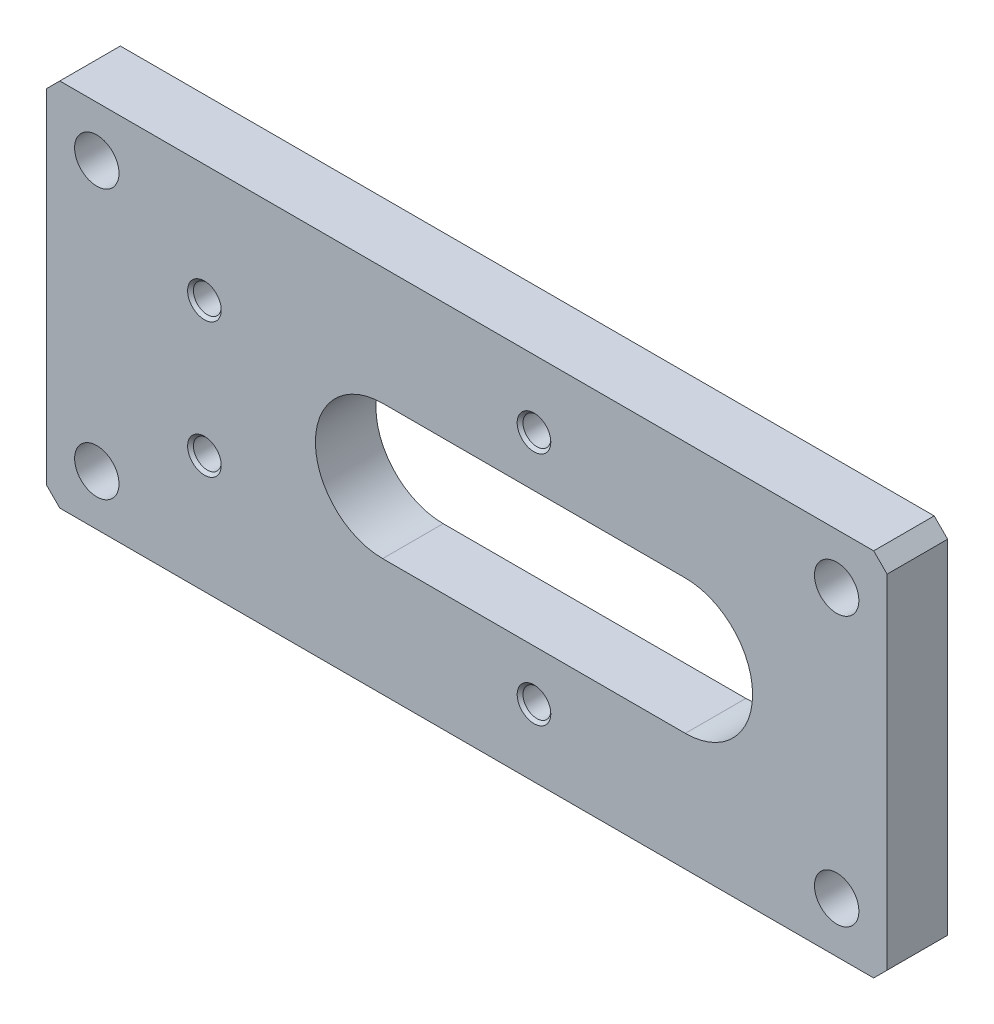
ISO-10303-21;
HEADER;
FILE_DESCRIPTION(('STEP AP214'),'2;1');
FILE_NAME('part.step','',(''),(''),'','','');
FILE_SCHEMA(('AUTOMOTIVE_DESIGN { 1 0 10303 214 1 1 1 1 }'));
ENDSEC;
DATA;
#1=APPLICATION_CONTEXT('core data for automotive mechanical design processes');
#2=APPLICATION_PROTOCOL_DEFINITION('international standard','automotive_design',2000,#1);
#3=PRODUCT_CONTEXT('',#1,'mechanical');
#4=PRODUCT('Part','Part','',(#3));
#5=PRODUCT_RELATED_PRODUCT_CATEGORY('part','',(#4));
#6=PRODUCT_DEFINITION_FORMATION('','',#4);
#7=PRODUCT_DEFINITION_CONTEXT('part definition',#1,'design');
#8=PRODUCT_DEFINITION('design','',#6,#7);
#9=PRODUCT_DEFINITION_SHAPE('','',#8);
#10=(LENGTH_UNIT() NAMED_UNIT(*) SI_UNIT(.MILLI.,.METRE.));
#11=(NAMED_UNIT(*) PLANE_ANGLE_UNIT() SI_UNIT($,.RADIAN.));
#12=(NAMED_UNIT(*) SI_UNIT($,.STERADIAN.) SOLID_ANGLE_UNIT());
#13=UNCERTAINTY_MEASURE_WITH_UNIT(LENGTH_MEASURE(1.E-05),#10,'distance_accuracy_value','');
#14=(GEOMETRIC_REPRESENTATION_CONTEXT(3) GLOBAL_UNCERTAINTY_ASSIGNED_CONTEXT((#13)) GLOBAL_UNIT_ASSIGNED_CONTEXT((#10,
#11,#12)) REPRESENTATION_CONTEXT('',''));
#15=CARTESIAN_POINT('',(0.,0.,0.));
#16=DIRECTION('',(0.,0.,1.));
#17=DIRECTION('',(1.,0.,0.));
#18=AXIS2_PLACEMENT_3D('',#15,#16,#17);
#19=CARTESIAN_POINT('',(12.5,17.5,9.0000000000714));
#20=DIRECTION('',(0.,0.,1.));
#21=DIRECTION('',(1.,0.,0.));
#22=AXIS2_PLACEMENT_3D('',#19,#20,#21);
#23=CONICAL_SURFACE('',#22,2.5000000000432,0.785398163397448);
#24=CARTESIAN_POINT('',(12.5,17.5,8.567));
#25=DIRECTION('',(0.,0.,1.));
#26=DIRECTION('',(1.,0.,0.));
#27=AXIS2_PLACEMENT_3D('',#24,#25,#26);
#28=CIRCLE('',#27,2.067);
#29=CARTESIAN_POINT('',(14.567,17.5,8.567));
#30=VERTEX_POINT('',#29);
#31=EDGE_CURVE('E121',#30,#30,#28,.F.);
#32=ORIENTED_EDGE('',*,*,#31,.T.);
#33=EDGE_LOOP('',(#32));
#34=FACE_BOUND('',#33,.T.);
#35=CARTESIAN_POINT('',(12.5,17.5,8.99999999995771));
#36=DIRECTION('',(0.,0.,1.));
#37=DIRECTION('',(1.,0.,0.));
#38=AXIS2_PLACEMENT_3D('',#35,#36,#37);
#39=CIRCLE('',#38,2.49999999992951);
#40=CARTESIAN_POINT('',(14.9999999999295,17.5,8.99999999995771));
#41=VERTEX_POINT('',#40);
#42=EDGE_CURVE('E20',#41,#41,#39,.F.);
#43=ORIENTED_EDGE('',*,*,#42,.F.);
#44=EDGE_LOOP('',(#43));
#45=FACE_BOUND('',#44,.T.);
#46=ADVANCED_FACE('F17',(#34,#45),#23,.F.);
#47=CARTESIAN_POINT('',(-36.5,10.,8.99999999990087));
#48=DIRECTION('',(0.,0.,1.));
#49=DIRECTION('',(1.,0.,0.));
#50=AXIS2_PLACEMENT_3D('',#47,#48,#49);
#51=CONICAL_SURFACE('',#50,2.4999999998945,0.785398163397448);
#52=CARTESIAN_POINT('',(-36.5,10.,8.567));
#53=DIRECTION('',(0.,0.,1.));
#54=DIRECTION('',(1.,0.,0.));
#55=AXIS2_PLACEMENT_3D('',#52,#53,#54);
#56=CIRCLE('',#55,2.067);
#57=CARTESIAN_POINT('',(-34.433,10.,8.567));
#58=VERTEX_POINT('',#57);
#59=EDGE_CURVE('E117',#58,#58,#56,.F.);
#60=ORIENTED_EDGE('',*,*,#59,.T.);
#61=EDGE_LOOP('',(#60));
#62=FACE_BOUND('',#61,.T.);
#63=CARTESIAN_POINT('',(-36.5,10.,9.00000000001455));
#64=DIRECTION('',(0.,0.,1.));
#65=DIRECTION('',(1.,0.,0.));
#66=AXIS2_PLACEMENT_3D('',#63,#64,#65);
#67=CIRCLE('',#66,2.50000000000818);
#68=CARTESIAN_POINT('',(-33.9999999999918,10.,9.00000000001455));
#69=VERTEX_POINT('',#68);
#70=EDGE_CURVE('E182',#69,#69,#67,.F.);
#71=ORIENTED_EDGE('',*,*,#70,.F.);
#72=EDGE_LOOP('',(#71));
#73=FACE_BOUND('',#72,.T.);
#74=ADVANCED_FACE('F196',(#62,#73),#51,.F.);
#75=CARTESIAN_POINT('',(-36.5,-10.,8.99999999990087));
#76=DIRECTION('',(0.,0.,1.));
#77=DIRECTION('',(1.,0.,0.));
#78=AXIS2_PLACEMENT_3D('',#75,#76,#77);
#79=CONICAL_SURFACE('',#78,2.4999999998945,0.785398163397448);
#80=CARTESIAN_POINT('',(-36.5,-10.,9.00000000001455));
#81=DIRECTION('',(0.,0.,1.));
#82=DIRECTION('',(1.,0.,0.));
#83=AXIS2_PLACEMENT_3D('',#80,#81,#82);
#84=CIRCLE('',#83,2.50000000000818);
#85=CARTESIAN_POINT('',(-33.9999999999918,-10.,9.00000000001455));
#86=VERTEX_POINT('',#85);
#87=EDGE_CURVE('E179',#86,#86,#84,.F.);
#88=ORIENTED_EDGE('',*,*,#87,.F.);
#89=EDGE_LOOP('',(#88));
#90=FACE_BOUND('',#89,.T.);
#91=CARTESIAN_POINT('',(-36.5,-10.,8.567));
#92=DIRECTION('',(0.,0.,1.));
#93=DIRECTION('',(1.,0.,0.));
#94=AXIS2_PLACEMENT_3D('',#91,#92,#93);
#95=CIRCLE('',#94,2.067);
#96=CARTESIAN_POINT('',(-34.433,-10.,8.567));
#97=VERTEX_POINT('',#96);
#98=EDGE_CURVE('E112',#97,#97,#95,.F.);
#99=ORIENTED_EDGE('',*,*,#98,.T.);
#100=EDGE_LOOP('',(#99));
#101=FACE_BOUND('',#100,.T.);
#102=ADVANCED_FACE('F201',(#90,#101),#79,.F.);
#103=CARTESIAN_POINT('',(12.5,-17.5,8.99999999990087));
#104=DIRECTION('',(0.,0.,1.));
#105=DIRECTION('',(1.,0.,0.));
#106=AXIS2_PLACEMENT_3D('',#103,#104,#105);
#107=CONICAL_SURFACE('',#106,2.49999999992951,0.785398163397448);
#108=CARTESIAN_POINT('',(12.5,-17.5,8.99999999995771));
#109=DIRECTION('',(0.,0.,1.));
#110=DIRECTION('',(1.,0.,0.));
#111=AXIS2_PLACEMENT_3D('',#108,#109,#110);
#112=CIRCLE('',#111,2.49999999998636);
#113=CARTESIAN_POINT('',(14.9999999999864,-17.5,8.99999999995771));
#114=VERTEX_POINT('',#113);
#115=EDGE_CURVE('E116',#114,#114,#112,.F.);
#116=ORIENTED_EDGE('',*,*,#115,.F.);
#117=EDGE_LOOP('',(#116));
#118=FACE_BOUND('',#117,.T.);
#119=CARTESIAN_POINT('',(12.5,-17.5,8.567));
#120=DIRECTION('',(0.,0.,1.));
#121=DIRECTION('',(1.,0.,0.));
#122=AXIS2_PLACEMENT_3D('',#119,#120,#121);
#123=CIRCLE('',#122,2.067);
#124=CARTESIAN_POINT('',(14.567,-17.5,8.567));
#125=VERTEX_POINT('',#124);
#126=EDGE_CURVE('E107',#125,#125,#123,.F.);
#127=ORIENTED_EDGE('',*,*,#126,.T.);
#128=EDGE_LOOP('',(#127));
#129=FACE_BOUND('',#128,.T.);
#130=ADVANCED_FACE('F305',(#118,#129),#107,.F.);
#131=CARTESIAN_POINT('',(12.5,17.5,0.));
#132=DIRECTION('',(0.,0.,1.));
#133=DIRECTION('',(1.,0.,0.));
#134=AXIS2_PLACEMENT_3D('',#131,#132,#133);
#135=CYLINDRICAL_SURFACE('',#134,2.067);
#136=ORIENTED_EDGE('',*,*,#31,.F.);
#137=EDGE_LOOP('',(#136));
#138=FACE_BOUND('',#137,.T.);
#139=CARTESIAN_POINT('',(12.5,17.5,0.432999999986805));
#140=DIRECTION('',(0.,0.,-1.));
#141=DIRECTION('',(-1.,0.,0.));
#142=AXIS2_PLACEMENT_3D('',#139,#140,#141);
#143=CIRCLE('',#142,2.06700000002229);
#144=CARTESIAN_POINT('',(10.4329999999777,17.5,0.432999999986805));
#145=VERTEX_POINT('',#144);
#146=EDGE_CURVE('E102',#145,#145,#143,.T.);
#147=ORIENTED_EDGE('',*,*,#146,.T.);
#148=EDGE_LOOP('',(#147));
#149=FACE_BOUND('',#148,.T.);
#150=ADVANCED_FACE('F301',(#138,#149),#135,.F.);
#151=CARTESIAN_POINT('',(-36.5,10.,0.));
#152=DIRECTION('',(0.,0.,1.));
#153=DIRECTION('',(1.,0.,0.));
#154=AXIS2_PLACEMENT_3D('',#151,#152,#153);
#155=CYLINDRICAL_SURFACE('',#154,2.067);
#156=CARTESIAN_POINT('',(-36.5,10.,0.433000000043648));
#157=DIRECTION('',(0.,0.,-1.));
#158=DIRECTION('',(-1.,0.,0.));
#159=AXIS2_PLACEMENT_3D('',#156,#157,#158);
#160=CIRCLE('',#159,2.06700000000046);
#161=CARTESIAN_POINT('',(-38.5670000000005,10.,0.433000000043648));
#162=VERTEX_POINT('',#161);
#163=EDGE_CURVE('E97',#162,#162,#160,.T.);
#164=ORIENTED_EDGE('',*,*,#163,.T.);
#165=EDGE_LOOP('',(#164));
#166=FACE_BOUND('',#165,.T.);
#167=ORIENTED_EDGE('',*,*,#59,.F.);
#168=EDGE_LOOP('',(#167));
#169=FACE_BOUND('',#168,.T.);
#170=ADVANCED_FACE('F297',(#166,#169),#155,.F.);
#171=CARTESIAN_POINT('',(0.,0.,9.));
#172=DIRECTION('',(0.,0.,1.));
#173=DIRECTION('',(1.,0.,0.));
#174=AXIS2_PLACEMENT_3D('',#171,#172,#173);
#175=PLANE('',#174);
#176=ORIENTED_EDGE('',*,*,#115,.T.);
#177=EDGE_LOOP('',(#176));
#178=FACE_BOUND('',#177,.T.);
#179=ORIENTED_EDGE('',*,*,#87,.T.);
#180=EDGE_LOOP('',(#179));
#181=FACE_BOUND('',#180,.T.);
#182=CARTESIAN_POINT('',(57.5,-20.,9.));
#183=DIRECTION('',(0.,0.,1.));
#184=DIRECTION('',(1.,0.,0.));
#185=AXIS2_PLACEMENT_3D('',#182,#183,#184);
#186=CIRCLE('',#185,3.3);
#187=CARTESIAN_POINT('',(60.8,-20.,9.));
#188=VERTEX_POINT('',#187);
#189=EDGE_CURVE('E161',#188,#188,#186,.F.);
#190=ORIENTED_EDGE('',*,*,#189,.T.);
#191=EDGE_LOOP('',(#190));
#192=FACE_BOUND('',#191,.T.);
#193=CARTESIAN_POINT('',(57.5,20.,9.));
#194=DIRECTION('',(0.,0.,1.));
#195=DIRECTION('',(1.,0.,0.));
#196=AXIS2_PLACEMENT_3D('',#193,#194,#195);
#197=CIRCLE('',#196,3.3);
#198=CARTESIAN_POINT('',(60.8,20.,9.));
#199=VERTEX_POINT('',#198);
#200=EDGE_CURVE('E88',#199,#199,#197,.F.);
#201=ORIENTED_EDGE('',*,*,#200,.T.);
#202=EDGE_LOOP('',(#201));
#203=FACE_BOUND('',#202,.T.);
#204=DIRECTION('',(1.,0.,0.));
#205=VECTOR('',#204,1.);
#206=CARTESIAN_POINT('',(-10.,-10.,9.));
#207=LINE('',#206,#205);
#208=CARTESIAN_POINT('',(-10.,-10.,9.));
#209=VERTEX_POINT('',#208);
#210=CARTESIAN_POINT('',(35.,-10.,9.));
#211=VERTEX_POINT('',#210);
#212=EDGE_CURVE('E69',#209,#211,#207,.T.);
#213=ORIENTED_EDGE('',*,*,#212,.F.);
#214=CARTESIAN_POINT('',(-10.,0.,9.));
#215=DIRECTION('',(0.,0.,1.));
#216=DIRECTION('',(1.,0.,0.));
#217=AXIS2_PLACEMENT_3D('',#214,#215,#216);
#218=CIRCLE('',#217,10.);
#219=CARTESIAN_POINT('',(-10.,10.,9.));
#220=VERTEX_POINT('',#219);
#221=EDGE_CURVE('E77',#209,#220,#218,.F.);
#222=ORIENTED_EDGE('',*,*,#221,.T.);
#223=DIRECTION('',(1.,0.,0.));
#224=VECTOR('',#223,1.);
#225=CARTESIAN_POINT('',(35.,10.,9.));
#226=LINE('',#225,#224);
#227=CARTESIAN_POINT('',(35.,10.,9.));
#228=VERTEX_POINT('',#227);
#229=EDGE_CURVE('E73',#228,#220,#226,.F.);
#230=ORIENTED_EDGE('',*,*,#229,.F.);
#231=CARTESIAN_POINT('',(35.,0.,9.));
#232=DIRECTION('',(0.,0.,1.));
#233=DIRECTION('',(1.,0.,0.));
#234=AXIS2_PLACEMENT_3D('',#231,#232,#233);
#235=CIRCLE('',#234,10.);
#236=EDGE_CURVE('E60',#228,#211,#235,.F.);
#237=ORIENTED_EDGE('',*,*,#236,.T.);
#238=EDGE_LOOP('',(#213,#222,#230,#237));
#239=FACE_BOUND('',#238,.T.);
#240=CARTESIAN_POINT('',(-52.5,-20.,9.));
#241=DIRECTION('',(0.,0.,1.));
#242=DIRECTION('',(1.,0.,0.));
#243=AXIS2_PLACEMENT_3D('',#240,#241,#242);
#244=CIRCLE('',#243,3.3);
#245=CARTESIAN_POINT('',(-49.2,-20.,9.));
#246=VERTEX_POINT('',#245);
#247=EDGE_CURVE('E70',#246,#246,#244,.F.);
#248=ORIENTED_EDGE('',*,*,#247,.T.);
#249=EDGE_LOOP('',(#248));
#250=FACE_BOUND('',#249,.T.);
#251=CARTESIAN_POINT('',(-52.5,20.,9.));
#252=DIRECTION('',(0.,0.,1.));
#253=DIRECTION('',(1.,0.,0.));
#254=AXIS2_PLACEMENT_3D('',#251,#252,#253);
#255=CIRCLE('',#254,3.3);
#256=CARTESIAN_POINT('',(-49.2,20.,9.));
#257=VERTEX_POINT('',#256);
#258=EDGE_CURVE('E101',#257,#257,#255,.F.);
#259=ORIENTED_EDGE('',*,*,#258,.T.);
#260=EDGE_LOOP('',(#259));
#261=FACE_BOUND('',#260,.T.);
#262=ORIENTED_EDGE('',*,*,#70,.T.);
#263=EDGE_LOOP('',(#262));
#264=FACE_BOUND('',#263,.T.);
#265=ORIENTED_EDGE('',*,*,#42,.T.);
#266=EDGE_LOOP('',(#265));
#267=FACE_BOUND('',#266,.T.);
#268=DIRECTION('',(0.707106781186548,-0.707106781186547,0.));
#269=VECTOR('',#268,1.);
#270=CARTESIAN_POINT('',(65.,25.5,9.));
#271=LINE('',#270,#269);
#272=CARTESIAN_POINT('',(65.,25.5,9.));
#273=VERTEX_POINT('',#272);
#274=CARTESIAN_POINT('',(63.,27.5,9.));
#275=VERTEX_POINT('',#274);
#276=EDGE_CURVE('E406',#273,#275,#271,.F.);
#277=ORIENTED_EDGE('',*,*,#276,.T.);
#278=DIRECTION('',(1.,0.,0.));
#279=VECTOR('',#278,1.);
#280=CARTESIAN_POINT('',(63.,27.5,9.));
#281=LINE('',#280,#279);
#282=CARTESIAN_POINT('',(-58.,27.5,9.));
#283=VERTEX_POINT('',#282);
#284=EDGE_CURVE('E400',#275,#283,#281,.F.);
#285=ORIENTED_EDGE('',*,*,#284,.T.);
#286=DIRECTION('',(0.707106781186547,0.707106781186548,0.));
#287=VECTOR('',#286,1.);
#288=CARTESIAN_POINT('',(-58.,27.5,9.));
#289=LINE('',#288,#287);
#290=CARTESIAN_POINT('',(-60.,25.5,9.));
#291=VERTEX_POINT('',#290);
#292=EDGE_CURVE('E394',#283,#291,#289,.F.);
#293=ORIENTED_EDGE('',*,*,#292,.T.);
#294=DIRECTION('',(0.,1.,0.));
#295=VECTOR('',#294,1.);
#296=CARTESIAN_POINT('',(-60.,25.5,9.));
#297=LINE('',#296,#295);
#298=CARTESIAN_POINT('',(-60.,-25.5,9.));
#299=VERTEX_POINT('',#298);
#300=EDGE_CURVE('E111',#291,#299,#297,.F.);
#301=ORIENTED_EDGE('',*,*,#300,.T.);
#302=DIRECTION('',(-0.707106781186547,0.707106781186548,0.));
#303=VECTOR('',#302,1.);
#304=CARTESIAN_POINT('',(-60.,-25.5,9.));
#305=LINE('',#304,#303);
#306=CARTESIAN_POINT('',(-58.,-27.5,9.));
#307=VERTEX_POINT('',#306);
#308=EDGE_CURVE('E435',#299,#307,#305,.F.);
#309=ORIENTED_EDGE('',*,*,#308,.T.);
#310=DIRECTION('',(1.,0.,0.));
#311=VECTOR('',#310,1.);
#312=CARTESIAN_POINT('',(-58.,-27.5,9.));
#313=LINE('',#312,#311);
#314=CARTESIAN_POINT('',(63.,-27.5,9.));
#315=VERTEX_POINT('',#314);
#316=EDGE_CURVE('E427',#307,#315,#313,.T.);
#317=ORIENTED_EDGE('',*,*,#316,.T.);
#318=DIRECTION('',(-0.707106781186548,-0.707106781186547,0.));
#319=VECTOR('',#318,1.);
#320=CARTESIAN_POINT('',(63.,-27.5,9.));
#321=LINE('',#320,#319);
#322=CARTESIAN_POINT('',(65.,-25.5,9.));
#323=VERTEX_POINT('',#322);
#324=EDGE_CURVE('E419',#315,#323,#321,.F.);
#325=ORIENTED_EDGE('',*,*,#324,.T.);
#326=DIRECTION('',(0.,1.,0.));
#327=VECTOR('',#326,1.);
#328=CARTESIAN_POINT('',(65.,-25.5,9.));
#329=LINE('',#328,#327);
#330=EDGE_CURVE('E411',#323,#273,#329,.T.);
#331=ORIENTED_EDGE('',*,*,#330,.T.);
#332=EDGE_LOOP('',(#277,#285,#293,#301,#309,#317,#325,#331));
#333=FACE_BOUND('',#332,.T.);
#334=ADVANCED_FACE('F79',(#178,#181,#192,#203,#239,#250,#261,#264,#267,#333),#175,.T.);
#335=CARTESIAN_POINT('',(-36.5,-10.,0.));
#336=DIRECTION('',(0.,0.,1.));
#337=DIRECTION('',(1.,0.,0.));
#338=AXIS2_PLACEMENT_3D('',#335,#336,#337);
#339=CYLINDRICAL_SURFACE('',#338,2.067);
#340=CARTESIAN_POINT('',(-36.5,-10.,0.433000000043648));
#341=DIRECTION('',(0.,0.,-1.));
#342=DIRECTION('',(-1.,0.,0.));
#343=AXIS2_PLACEMENT_3D('',#340,#341,#342);
#344=CIRCLE('',#343,2.06700000000046);
#345=CARTESIAN_POINT('',(-38.5670000000005,-10.,0.433000000043648));
#346=VERTEX_POINT('',#345);
#347=EDGE_CURVE('E92',#346,#346,#344,.T.);
#348=ORIENTED_EDGE('',*,*,#347,.T.);
#349=EDGE_LOOP('',(#348));
#350=FACE_BOUND('',#349,.T.);
#351=ORIENTED_EDGE('',*,*,#98,.F.);
#352=EDGE_LOOP('',(#351));
#353=FACE_BOUND('',#352,.T.);
#354=ADVANCED_FACE('F290',(#350,#353),#339,.F.);
#355=CARTESIAN_POINT('',(12.5,-17.5,0.));
#356=DIRECTION('',(0.,0.,1.));
#357=DIRECTION('',(1.,0.,0.));
#358=AXIS2_PLACEMENT_3D('',#355,#356,#357);
#359=CYLINDRICAL_SURFACE('',#358,2.067);
#360=CARTESIAN_POINT('',(12.5,-17.5,0.432999999986805));
#361=DIRECTION('',(0.,0.,-1.));
#362=DIRECTION('',(-1.,0.,0.));
#363=AXIS2_PLACEMENT_3D('',#360,#361,#362);
#364=CIRCLE('',#363,2.06700000002229);
#365=CARTESIAN_POINT('',(10.4329999999777,-17.5,0.432999999986805));
#366=VERTEX_POINT('',#365);
#367=EDGE_CURVE('E385',#366,#366,#364,.T.);
#368=ORIENTED_EDGE('',*,*,#367,.T.);
#369=EDGE_LOOP('',(#368));
#370=FACE_BOUND('',#369,.T.);
#371=ORIENTED_EDGE('',*,*,#126,.F.);
#372=EDGE_LOOP('',(#371));
#373=FACE_BOUND('',#372,.T.);
#374=ADVANCED_FACE('F286',(#370,#373),#359,.F.);
#375=CARTESIAN_POINT('',(-60.,25.5,9.));
#376=DIRECTION('',(1.,0.,0.));
#377=DIRECTION('',(0.,0.,-1.));
#378=AXIS2_PLACEMENT_3D('',#375,#376,#377);
#379=PLANE('',#378);
#380=DIRECTION('',(0.,0.,1.));
#381=VECTOR('',#380,1.);
#382=CARTESIAN_POINT('',(-60.,-25.5,9.));
#383=LINE('',#382,#381);
#384=CARTESIAN_POINT('',(-60.,-25.5,0.));
#385=VERTEX_POINT('',#384);
#386=EDGE_CURVE('E439',#385,#299,#383,.T.);
#387=ORIENTED_EDGE('',*,*,#386,.T.);
#388=ORIENTED_EDGE('',*,*,#300,.F.);
#389=DIRECTION('',(0.,0.,1.));
#390=VECTOR('',#389,1.);
#391=CARTESIAN_POINT('',(-60.,25.5,9.));
#392=LINE('',#391,#390);
#393=CARTESIAN_POINT('',(-60.,25.5,0.));
#394=VERTEX_POINT('',#393);
#395=EDGE_CURVE('E106',#291,#394,#392,.F.);
#396=ORIENTED_EDGE('',*,*,#395,.T.);
#397=DIRECTION('',(0.,1.,0.));
#398=VECTOR('',#397,1.);
#399=CARTESIAN_POINT('',(-60.,0.,0.));
#400=LINE('',#399,#398);
#401=EDGE_CURVE('E382',#394,#385,#400,.F.);
#402=ORIENTED_EDGE('',*,*,#401,.T.);
#403=EDGE_LOOP('',(#387,#388,#396,#402));
#404=FACE_BOUND('',#403,.T.);
#405=ADVANCED_FACE('F282',(#404),#379,.F.);
#406=CARTESIAN_POINT('',(-60.,-25.5,9.));
#407=DIRECTION('',(0.707106781186548,0.707106781186547,0.));
#408=DIRECTION('',(-0.707106781186547,0.707106781186548,0.));
#409=AXIS2_PLACEMENT_3D('',#406,#407,#408);
#410=PLANE('',#409);
#411=DIRECTION('',(0.,0.,1.));
#412=VECTOR('',#411,1.);
#413=CARTESIAN_POINT('',(-58.,-27.5,9.));
#414=LINE('',#413,#412);
#415=CARTESIAN_POINT('',(-58.,-27.5,0.));
#416=VERTEX_POINT('',#415);
#417=EDGE_CURVE('E431',#416,#307,#414,.T.);
#418=ORIENTED_EDGE('',*,*,#417,.T.);
#419=ORIENTED_EDGE('',*,*,#308,.F.);
#420=ORIENTED_EDGE('',*,*,#386,.F.);
#421=DIRECTION('',(0.707106781186547,-0.707106781186548,0.));
#422=VECTOR('',#421,1.);
#423=CARTESIAN_POINT('',(-60.,-25.5,0.));
#424=LINE('',#423,#422);
#425=EDGE_CURVE('E378',#385,#416,#424,.T.);
#426=ORIENTED_EDGE('',*,*,#425,.T.);
#427=EDGE_LOOP('',(#418,#419,#420,#426));
#428=FACE_BOUND('',#427,.T.);
#429=ADVANCED_FACE('F278',(#428),#410,.F.);
#430=CARTESIAN_POINT('',(-58.,-27.5,9.));
#431=DIRECTION('',(0.,1.,0.));
#432=DIRECTION('',(0.,0.,1.));
#433=AXIS2_PLACEMENT_3D('',#430,#431,#432);
#434=PLANE('',#433);
#435=DIRECTION('',(0.,0.,1.));
#436=VECTOR('',#435,1.);
#437=CARTESIAN_POINT('',(63.,-27.5,9.));
#438=LINE('',#437,#436);
#439=CARTESIAN_POINT('',(63.,-27.5,0.));
#440=VERTEX_POINT('',#439);
#441=EDGE_CURVE('E423',#440,#315,#438,.T.);
#442=ORIENTED_EDGE('',*,*,#441,.T.);
#443=ORIENTED_EDGE('',*,*,#316,.F.);
#444=ORIENTED_EDGE('',*,*,#417,.F.);
#445=DIRECTION('',(1.,0.,0.));
#446=VECTOR('',#445,1.);
#447=CARTESIAN_POINT('',(0.,-27.5,0.));
#448=LINE('',#447,#446);
#449=EDGE_CURVE('E375',#416,#440,#448,.T.);
#450=ORIENTED_EDGE('',*,*,#449,.T.);
#451=EDGE_LOOP('',(#442,#443,#444,#450));
#452=FACE_BOUND('',#451,.T.);
#453=ADVANCED_FACE('F274',(#452),#434,.F.);
#454=CARTESIAN_POINT('',(63.,-27.5,9.));
#455=DIRECTION('',(-0.707106781186547,0.707106781186548,0.));
#456=DIRECTION('',(-0.707106781186548,-0.707106781186547,0.));
#457=AXIS2_PLACEMENT_3D('',#454,#455,#456);
#458=PLANE('',#457);
#459=DIRECTION('',(0.,0.,1.));
#460=VECTOR('',#459,1.);
#461=CARTESIAN_POINT('',(65.,-25.5,9.));
#462=LINE('',#461,#460);
#463=CARTESIAN_POINT('',(65.,-25.5,0.));
#464=VERTEX_POINT('',#463);
#465=EDGE_CURVE('E415',#464,#323,#462,.T.);
#466=ORIENTED_EDGE('',*,*,#465,.T.);
#467=ORIENTED_EDGE('',*,*,#324,.F.);
#468=ORIENTED_EDGE('',*,*,#441,.F.);
#469=DIRECTION('',(0.707106781186548,0.707106781186547,0.));
#470=VECTOR('',#469,1.);
#471=CARTESIAN_POINT('',(63.,-27.5,0.));
#472=LINE('',#471,#470);
#473=EDGE_CURVE('E368',#440,#464,#472,.T.);
#474=ORIENTED_EDGE('',*,*,#473,.T.);
#475=EDGE_LOOP('',(#466,#467,#468,#474));
#476=FACE_BOUND('',#475,.T.);
#477=ADVANCED_FACE('F270',(#476),#458,.F.);
#478=CARTESIAN_POINT('',(65.,-25.5,9.));
#479=DIRECTION('',(-1.,0.,0.));
#480=DIRECTION('',(0.,0.,1.));
#481=AXIS2_PLACEMENT_3D('',#478,#479,#480);
#482=PLANE('',#481);
#483=DIRECTION('',(0.,0.,1.));
#484=VECTOR('',#483,1.);
#485=CARTESIAN_POINT('',(65.,25.5,9.));
#486=LINE('',#485,#484);
#487=CARTESIAN_POINT('',(65.,25.5,0.));
#488=VERTEX_POINT('',#487);
#489=EDGE_CURVE('E362',#488,#273,#486,.T.);
#490=ORIENTED_EDGE('',*,*,#489,.T.);
#491=ORIENTED_EDGE('',*,*,#330,.F.);
#492=ORIENTED_EDGE('',*,*,#465,.F.);
#493=DIRECTION('',(0.,1.,0.));
#494=VECTOR('',#493,1.);
#495=CARTESIAN_POINT('',(65.,0.,0.));
#496=LINE('',#495,#494);
#497=EDGE_CURVE('E364',#464,#488,#496,.T.);
#498=ORIENTED_EDGE('',*,*,#497,.T.);
#499=EDGE_LOOP('',(#490,#491,#492,#498));
#500=FACE_BOUND('',#499,.T.);
#501=ADVANCED_FACE('F266',(#500),#482,.F.);
#502=CARTESIAN_POINT('',(65.,25.5,9.));
#503=DIRECTION('',(-0.707106781186547,-0.707106781186548,0.));
#504=DIRECTION('',(0.707106781186548,-0.707106781186547,0.));
#505=AXIS2_PLACEMENT_3D('',#502,#503,#504);
#506=PLANE('',#505);
#507=DIRECTION('',(0.,0.,-1.));
#508=VECTOR('',#507,1.);
#509=CARTESIAN_POINT('',(63.,27.5,9.));
#510=LINE('',#509,#508);
#511=CARTESIAN_POINT('',(63.,27.5,0.));
#512=VERTEX_POINT('',#511);
#513=EDGE_CURVE('E360',#512,#275,#510,.F.);
#514=ORIENTED_EDGE('',*,*,#513,.T.);
#515=ORIENTED_EDGE('',*,*,#276,.F.);
#516=ORIENTED_EDGE('',*,*,#489,.F.);
#517=DIRECTION('',(-0.707106781186548,0.707106781186547,0.));
#518=VECTOR('',#517,1.);
#519=CARTESIAN_POINT('',(65.,25.5,0.));
#520=LINE('',#519,#518);
#521=EDGE_CURVE('E347',#488,#512,#520,.T.);
#522=ORIENTED_EDGE('',*,*,#521,.T.);
#523=EDGE_LOOP('',(#514,#515,#516,#522));
#524=FACE_BOUND('',#523,.T.);
#525=ADVANCED_FACE('F262',(#524),#506,.F.);
#526=CARTESIAN_POINT('',(63.,27.5,9.));
#527=DIRECTION('',(0.,-1.,0.));
#528=DIRECTION('',(0.,0.,-1.));
#529=AXIS2_PLACEMENT_3D('',#526,#527,#528);
#530=PLANE('',#529);
#531=DIRECTION('',(0.,0.,1.));
#532=VECTOR('',#531,1.);
#533=CARTESIAN_POINT('',(-58.,27.5,9.));
#534=LINE('',#533,#532);
#535=CARTESIAN_POINT('',(-58.,27.5,0.));
#536=VERTEX_POINT('',#535);
#537=EDGE_CURVE('E398',#536,#283,#534,.T.);
#538=ORIENTED_EDGE('',*,*,#537,.T.);
#539=ORIENTED_EDGE('',*,*,#284,.F.);
#540=ORIENTED_EDGE('',*,*,#513,.F.);
#541=DIRECTION('',(1.,0.,0.));
#542=VECTOR('',#541,1.);
#543=CARTESIAN_POINT('',(0.,27.5,0.));
#544=LINE('',#543,#542);
#545=EDGE_CURVE('E343',#512,#536,#544,.F.);
#546=ORIENTED_EDGE('',*,*,#545,.T.);
#547=EDGE_LOOP('',(#538,#539,#540,#546));
#548=FACE_BOUND('',#547,.T.);
#549=ADVANCED_FACE('F258',(#548),#530,.F.);
#550=CARTESIAN_POINT('',(-58.,27.5,9.));
#551=DIRECTION('',(0.707106781186548,-0.707106781186547,0.));
#552=DIRECTION('',(0.707106781186547,0.707106781186548,0.));
#553=AXIS2_PLACEMENT_3D('',#550,#551,#552);
#554=PLANE('',#553);
#555=ORIENTED_EDGE('',*,*,#395,.F.);
#556=ORIENTED_EDGE('',*,*,#292,.F.);
#557=ORIENTED_EDGE('',*,*,#537,.F.);
#558=DIRECTION('',(-0.707106781186547,-0.707106781186548,0.));
#559=VECTOR('',#558,1.);
#560=CARTESIAN_POINT('',(-58.,27.5,0.));
#561=LINE('',#560,#559);
#562=EDGE_CURVE('E160',#536,#394,#561,.T.);
#563=ORIENTED_EDGE('',*,*,#562,.T.);
#564=EDGE_LOOP('',(#555,#556,#557,#563));
#565=FACE_BOUND('',#564,.T.);
#566=ADVANCED_FACE('F254',(#565),#554,.F.);
#567=CARTESIAN_POINT('',(12.5,17.5,1.13686837721616E-10));
#568=DIRECTION('',(0.,0.,-1.));
#569=DIRECTION('',(-1.,0.,0.));
#570=AXIS2_PLACEMENT_3D('',#567,#568,#569);
#571=CONICAL_SURFACE('',#570,2.49999999989541,0.785398163397448);
#572=ORIENTED_EDGE('',*,*,#146,.F.);
#573=EDGE_LOOP('',(#572));
#574=FACE_BOUND('',#573,.T.);
#575=CARTESIAN_POINT('',(12.5,17.5,5.6843418860808E-11));
#576=DIRECTION('',(0.,0.,-1.));
#577=DIRECTION('',(-1.,0.,0.));
#578=AXIS2_PLACEMENT_3D('',#575,#576,#577);
#579=CIRCLE('',#578,2.49999999995225);
#580=CARTESIAN_POINT('',(10.0000000000477,17.5,5.6843418860808E-11));
#581=VERTEX_POINT('',#580);
#582=EDGE_CURVE('E156',#581,#581,#579,.T.);
#583=ORIENTED_EDGE('',*,*,#582,.T.);
#584=EDGE_LOOP('',(#583));
#585=FACE_BOUND('',#584,.T.);
#586=ADVANCED_FACE('F250',(#574,#585),#571,.F.);
#587=CARTESIAN_POINT('',(-36.5,10.,5.6843418860808E-11));
#588=DIRECTION('',(0.,0.,-1.));
#589=DIRECTION('',(-1.,0.,0.));
#590=AXIS2_PLACEMENT_3D('',#587,#588,#589);
#591=CONICAL_SURFACE('',#590,2.50000000004411,0.785398163463087);
#592=ORIENTED_EDGE('',*,*,#163,.F.);
#593=EDGE_LOOP('',(#592));
#594=FACE_BOUND('',#593,.T.);
#595=CARTESIAN_POINT('',(-36.5,10.,4.63865057489926E-11));
#596=DIRECTION('',(0.,0.,-1.));
#597=DIRECTION('',(-1.,0.,0.));
#598=AXIS2_PLACEMENT_3D('',#595,#596,#597);
#599=CIRCLE('',#598,2.50000000005457);
#600=CARTESIAN_POINT('',(-39.0000000000546,10.,4.63865057489926E-11));
#601=VERTEX_POINT('',#600);
#602=EDGE_CURVE('E152',#601,#601,#599,.T.);
#603=ORIENTED_EDGE('',*,*,#602,.T.);
#604=EDGE_LOOP('',(#603));
#605=FACE_BOUND('',#604,.T.);
#606=ADVANCED_FACE('F246',(#594,#605),#591,.F.);
#607=CARTESIAN_POINT('',(-52.5,20.,9.));
#608=DIRECTION('',(0.,0.,1.));
#609=DIRECTION('',(1.,0.,0.));
#610=AXIS2_PLACEMENT_3D('',#607,#608,#609);
#611=CYLINDRICAL_SURFACE('',#610,3.3);
#612=ORIENTED_EDGE('',*,*,#258,.F.);
#613=EDGE_LOOP('',(#612));
#614=FACE_BOUND('',#613,.T.);
#615=CARTESIAN_POINT('',(-52.5,20.,0.));
#616=DIRECTION('',(0.,0.,1.));
#617=DIRECTION('',(1.,0.,0.));
#618=AXIS2_PLACEMENT_3D('',#615,#616,#617);
#619=CIRCLE('',#618,3.3);
#620=CARTESIAN_POINT('',(-49.2,20.,0.));
#621=VERTEX_POINT('',#620);
#622=EDGE_CURVE('E148',#621,#621,#619,.F.);
#623=ORIENTED_EDGE('',*,*,#622,.T.);
#624=EDGE_LOOP('',(#623));
#625=FACE_BOUND('',#624,.T.);
#626=ADVANCED_FACE('F242',(#614,#625),#611,.F.);
#627=CARTESIAN_POINT('',(-52.5,-20.,9.));
#628=DIRECTION('',(0.,0.,1.));
#629=DIRECTION('',(1.,0.,0.));
#630=AXIS2_PLACEMENT_3D('',#627,#628,#629);
#631=CYLINDRICAL_SURFACE('',#630,3.3);
#632=CARTESIAN_POINT('',(-52.5,-20.,0.));
#633=DIRECTION('',(0.,0.,1.));
#634=DIRECTION('',(1.,0.,0.));
#635=AXIS2_PLACEMENT_3D('',#632,#633,#634);
#636=CIRCLE('',#635,3.3);
#637=CARTESIAN_POINT('',(-49.2,-20.,0.));
#638=VERTEX_POINT('',#637);
#639=EDGE_CURVE('E144',#638,#638,#636,.F.);
#640=ORIENTED_EDGE('',*,*,#639,.T.);
#641=EDGE_LOOP('',(#640));
#642=FACE_BOUND('',#641,.T.);
#643=ORIENTED_EDGE('',*,*,#247,.F.);
#644=EDGE_LOOP('',(#643));
#645=FACE_BOUND('',#644,.T.);
#646=ADVANCED_FACE('F239',(#642,#645),#631,.F.);
#647=CARTESIAN_POINT('',(35.,0.,9.));
#648=DIRECTION('',(0.,0.,1.));
#649=DIRECTION('',(1.,0.,0.));
#650=AXIS2_PLACEMENT_3D('',#647,#648,#649);
#651=CYLINDRICAL_SURFACE('',#650,10.);
#652=DIRECTION('',(0.,0.,1.));
#653=VECTOR('',#652,1.);
#654=CARTESIAN_POINT('',(35.,-10.,9.));
#655=LINE('',#654,#653);
#656=CARTESIAN_POINT('',(35.,-10.,0.));
#657=VERTEX_POINT('',#656);
#658=EDGE_CURVE('E65',#211,#657,#655,.F.);
#659=ORIENTED_EDGE('',*,*,#658,.F.);
#660=ORIENTED_EDGE('',*,*,#236,.F.);
#661=DIRECTION('',(0.,0.,-1.));
#662=VECTOR('',#661,1.);
#663=CARTESIAN_POINT('',(35.,10.,9.));
#664=LINE('',#663,#662);
#665=CARTESIAN_POINT('',(35.,10.,0.));
#666=VERTEX_POINT('',#665);
#667=EDGE_CURVE('E64',#666,#228,#664,.F.);
#668=ORIENTED_EDGE('',*,*,#667,.F.);
#669=CARTESIAN_POINT('',(35.,0.,0.));
#670=DIRECTION('',(0.,0.,1.));
#671=DIRECTION('',(1.,0.,0.));
#672=AXIS2_PLACEMENT_3D('',#669,#670,#671);
#673=CIRCLE('',#672,10.);
#674=EDGE_CURVE('E141',#666,#657,#673,.F.);
#675=ORIENTED_EDGE('',*,*,#674,.T.);
#676=EDGE_LOOP('',(#659,#660,#668,#675));
#677=FACE_BOUND('',#676,.T.);
#678=ADVANCED_FACE('F62',(#677),#651,.F.);
#679=CARTESIAN_POINT('',(-10.,-10.,9.));
#680=DIRECTION('',(0.,1.,0.));
#681=DIRECTION('',(0.,0.,1.));
#682=AXIS2_PLACEMENT_3D('',#679,#680,#681);
#683=PLANE('',#682);
#684=ORIENTED_EDGE('',*,*,#212,.T.);
#685=ORIENTED_EDGE('',*,*,#658,.T.);
#686=DIRECTION('',(1.,0.,0.));
#687=VECTOR('',#686,1.);
#688=CARTESIAN_POINT('',(0.,-10.,0.));
#689=LINE('',#688,#687);
#690=CARTESIAN_POINT('',(-10.,-10.,0.));
#691=VERTEX_POINT('',#690);
#692=EDGE_CURVE('E140',#657,#691,#689,.F.);
#693=ORIENTED_EDGE('',*,*,#692,.T.);
#694=DIRECTION('',(0.,0.,1.));
#695=VECTOR('',#694,1.);
#696=CARTESIAN_POINT('',(-10.,-10.,9.));
#697=LINE('',#696,#695);
#698=EDGE_CURVE('E169',#691,#209,#697,.T.);
#699=ORIENTED_EDGE('',*,*,#698,.T.);
#700=EDGE_LOOP('',(#684,#685,#693,#699));
#701=FACE_BOUND('',#700,.T.);
#702=ADVANCED_FACE('F232',(#701),#683,.T.);
#703=CARTESIAN_POINT('',(-10.,0.,9.));
#704=DIRECTION('',(0.,0.,1.));
#705=DIRECTION('',(1.,0.,0.));
#706=AXIS2_PLACEMENT_3D('',#703,#704,#705);
#707=CYLINDRICAL_SURFACE('',#706,10.);
#708=DIRECTION('',(0.,0.,-1.));
#709=VECTOR('',#708,1.);
#710=CARTESIAN_POINT('',(-10.,10.,9.));
#711=LINE('',#710,#709);
#712=CARTESIAN_POINT('',(-10.,10.,0.));
#713=VERTEX_POINT('',#712);
#714=EDGE_CURVE('E36',#220,#713,#711,.T.);
#715=ORIENTED_EDGE('',*,*,#714,.F.);
#716=ORIENTED_EDGE('',*,*,#221,.F.);
#717=ORIENTED_EDGE('',*,*,#698,.F.);
#718=CARTESIAN_POINT('',(-10.,0.,0.));
#719=DIRECTION('',(0.,0.,1.));
#720=DIRECTION('',(1.,0.,0.));
#721=AXIS2_PLACEMENT_3D('',#718,#719,#720);
#722=CIRCLE('',#721,10.);
#723=EDGE_CURVE('E136',#691,#713,#722,.F.);
#724=ORIENTED_EDGE('',*,*,#723,.T.);
#725=EDGE_LOOP('',(#715,#716,#717,#724));
#726=FACE_BOUND('',#725,.T.);
#727=ADVANCED_FACE('F229',(#726),#707,.F.);
#728=CARTESIAN_POINT('',(35.,10.,9.));
#729=DIRECTION('',(0.,-1.,0.));
#730=DIRECTION('',(0.,0.,-1.));
#731=AXIS2_PLACEMENT_3D('',#728,#729,#730);
#732=PLANE('',#731);
#733=ORIENTED_EDGE('',*,*,#229,.T.);
#734=ORIENTED_EDGE('',*,*,#714,.T.);
#735=DIRECTION('',(1.,0.,0.));
#736=VECTOR('',#735,1.);
#737=CARTESIAN_POINT('',(0.,10.,0.));
#738=LINE('',#737,#736);
#739=EDGE_CURVE('E75',#713,#666,#738,.T.);
#740=ORIENTED_EDGE('',*,*,#739,.T.);
#741=ORIENTED_EDGE('',*,*,#667,.T.);
#742=EDGE_LOOP('',(#733,#734,#740,#741));
#743=FACE_BOUND('',#742,.T.);
#744=ADVANCED_FACE('F72',(#743),#732,.T.);
#745=CARTESIAN_POINT('',(57.5,20.,9.));
#746=DIRECTION('',(0.,0.,1.));
#747=DIRECTION('',(1.,0.,0.));
#748=AXIS2_PLACEMENT_3D('',#745,#746,#747);
#749=CYLINDRICAL_SURFACE('',#748,3.3);
#750=ORIENTED_EDGE('',*,*,#200,.F.);
#751=EDGE_LOOP('',(#750));
#752=FACE_BOUND('',#751,.T.);
#753=CARTESIAN_POINT('',(57.5,20.,0.));
#754=DIRECTION('',(0.,0.,1.));
#755=DIRECTION('',(1.,0.,0.));
#756=AXIS2_PLACEMENT_3D('',#753,#754,#755);
#757=CIRCLE('',#756,3.3);
#758=CARTESIAN_POINT('',(60.8,20.,0.));
#759=VERTEX_POINT('',#758);
#760=EDGE_CURVE('E132',#759,#759,#757,.F.);
#761=ORIENTED_EDGE('',*,*,#760,.T.);
#762=EDGE_LOOP('',(#761));
#763=FACE_BOUND('',#762,.T.);
#764=ADVANCED_FACE('F222',(#752,#763),#749,.F.);
#765=CARTESIAN_POINT('',(57.5,-20.,9.));
#766=DIRECTION('',(0.,0.,1.));
#767=DIRECTION('',(1.,0.,0.));
#768=AXIS2_PLACEMENT_3D('',#765,#766,#767);
#769=CYLINDRICAL_SURFACE('',#768,3.3);
#770=CARTESIAN_POINT('',(57.5,-20.,0.));
#771=DIRECTION('',(0.,0.,1.));
#772=DIRECTION('',(1.,0.,0.));
#773=AXIS2_PLACEMENT_3D('',#770,#771,#772);
#774=CIRCLE('',#773,3.3);
#775=CARTESIAN_POINT('',(60.8,-20.,0.));
#776=VERTEX_POINT('',#775);
#777=EDGE_CURVE('E128',#776,#776,#774,.F.);
#778=ORIENTED_EDGE('',*,*,#777,.T.);
#779=EDGE_LOOP('',(#778));
#780=FACE_BOUND('',#779,.T.);
#781=ORIENTED_EDGE('',*,*,#189,.F.);
#782=EDGE_LOOP('',(#781));
#783=FACE_BOUND('',#782,.T.);
#784=ADVANCED_FACE('F218',(#780,#783),#769,.F.);
#785=CARTESIAN_POINT('',(-36.5,-10.,5.6843418860808E-11));
#786=DIRECTION('',(0.,0.,-1.));
#787=DIRECTION('',(-1.,0.,0.));
#788=AXIS2_PLACEMENT_3D('',#785,#786,#787);
#789=CONICAL_SURFACE('',#788,2.50000000004411,0.785398163463087);
#790=ORIENTED_EDGE('',*,*,#347,.F.);
#791=EDGE_LOOP('',(#790));
#792=FACE_BOUND('',#791,.T.);
#793=CARTESIAN_POINT('',(-36.5,-10.,4.63865057489926E-11));
#794=DIRECTION('',(0.,0.,-1.));
#795=DIRECTION('',(-1.,0.,0.));
#796=AXIS2_PLACEMENT_3D('',#793,#794,#795);
#797=CIRCLE('',#796,2.50000000005457);
#798=CARTESIAN_POINT('',(-39.0000000000546,-10.,4.63865057489926E-11));
#799=VERTEX_POINT('',#798);
#800=EDGE_CURVE('E27',#799,#799,#797,.T.);
#801=ORIENTED_EDGE('',*,*,#800,.T.);
#802=EDGE_LOOP('',(#801));
#803=FACE_BOUND('',#802,.T.);
#804=ADVANCED_FACE('F210',(#792,#803),#789,.F.);
#805=CARTESIAN_POINT('',(12.5,-17.5,0.));
#806=DIRECTION('',(0.,0.,-1.));
#807=DIRECTION('',(-1.,0.,0.));
#808=AXIS2_PLACEMENT_3D('',#805,#806,#807);
#809=CONICAL_SURFACE('',#808,2.50000000006594,0.785398163463087);
#810=ORIENTED_EDGE('',*,*,#367,.F.);
#811=EDGE_LOOP('',(#810));
#812=FACE_BOUND('',#811,.T.);
#813=CARTESIAN_POINT('',(12.5,-17.5,1.13693776600594E-11));
#814=DIRECTION('',(0.,0.,-1.));
#815=DIRECTION('',(-1.,0.,0.));
#816=AXIS2_PLACEMENT_3D('',#813,#814,#815);
#817=CIRCLE('',#816,2.50000000005457);
#818=CARTESIAN_POINT('',(9.99999999994543,-17.5,1.13693776600594E-11));
#819=VERTEX_POINT('',#818);
#820=EDGE_CURVE('E11',#819,#819,#817,.T.);
#821=ORIENTED_EDGE('',*,*,#820,.T.);
#822=EDGE_LOOP('',(#821));
#823=FACE_BOUND('',#822,.T.);
#824=ADVANCED_FACE('F205',(#812,#823),#809,.F.);
#825=CARTESIAN_POINT('',(0.,0.,0.));
#826=DIRECTION('',(0.,0.,1.));
#827=DIRECTION('',(1.,0.,0.));
#828=AXIS2_PLACEMENT_3D('',#825,#826,#827);
#829=PLANE('',#828);
#830=ORIENTED_EDGE('',*,*,#820,.F.);
#831=EDGE_LOOP('',(#830));
#832=FACE_BOUND('',#831,.T.);
#833=ORIENTED_EDGE('',*,*,#800,.F.);
#834=EDGE_LOOP('',(#833));
#835=FACE_BOUND('',#834,.T.);
#836=ORIENTED_EDGE('',*,*,#777,.F.);
#837=EDGE_LOOP('',(#836));
#838=FACE_BOUND('',#837,.T.);
#839=ORIENTED_EDGE('',*,*,#760,.F.);
#840=EDGE_LOOP('',(#839));
#841=FACE_BOUND('',#840,.T.);
#842=ORIENTED_EDGE('',*,*,#723,.F.);
#843=ORIENTED_EDGE('',*,*,#692,.F.);
#844=ORIENTED_EDGE('',*,*,#674,.F.);
#845=ORIENTED_EDGE('',*,*,#739,.F.);
#846=EDGE_LOOP('',(#842,#843,#844,#845));
#847=FACE_BOUND('',#846,.T.);
#848=ORIENTED_EDGE('',*,*,#639,.F.);
#849=EDGE_LOOP('',(#848));
#850=FACE_BOUND('',#849,.T.);
#851=ORIENTED_EDGE('',*,*,#622,.F.);
#852=EDGE_LOOP('',(#851));
#853=FACE_BOUND('',#852,.T.);
#854=ORIENTED_EDGE('',*,*,#602,.F.);
#855=EDGE_LOOP('',(#854));
#856=FACE_BOUND('',#855,.T.);
#857=ORIENTED_EDGE('',*,*,#582,.F.);
#858=EDGE_LOOP('',(#857));
#859=FACE_BOUND('',#858,.T.);
#860=ORIENTED_EDGE('',*,*,#545,.F.);
#861=ORIENTED_EDGE('',*,*,#521,.F.);
#862=ORIENTED_EDGE('',*,*,#497,.F.);
#863=ORIENTED_EDGE('',*,*,#473,.F.);
#864=ORIENTED_EDGE('',*,*,#449,.F.);
#865=ORIENTED_EDGE('',*,*,#425,.F.);
#866=ORIENTED_EDGE('',*,*,#401,.F.);
#867=ORIENTED_EDGE('',*,*,#562,.F.);
#868=EDGE_LOOP('',(#860,#861,#862,#863,#864,#865,#866,#867));
#869=FACE_BOUND('',#868,.T.);
#870=ADVANCED_FACE('F203',(#832,#835,#838,#841,#847,#850,#853,#856,#859,#869),#829,.F.);
#871=CLOSED_SHELL('',(#46,#74,#102,#130,#150,#170,#334,#354,#374,#405,#429,#453,#477,#501,#525,
#549,#566,#586,#606,#626,#646,#678,#702,#727,#744,#764,#784,#804,#824,#870));
#872=MANIFOLD_SOLID_BREP('B1',#871);
#873=ADVANCED_BREP_SHAPE_REPRESENTATION('',(#18,#872),#14);
#874=SHAPE_DEFINITION_REPRESENTATION(#9,#873);
ENDSEC;
END-ISO-10303-21;
